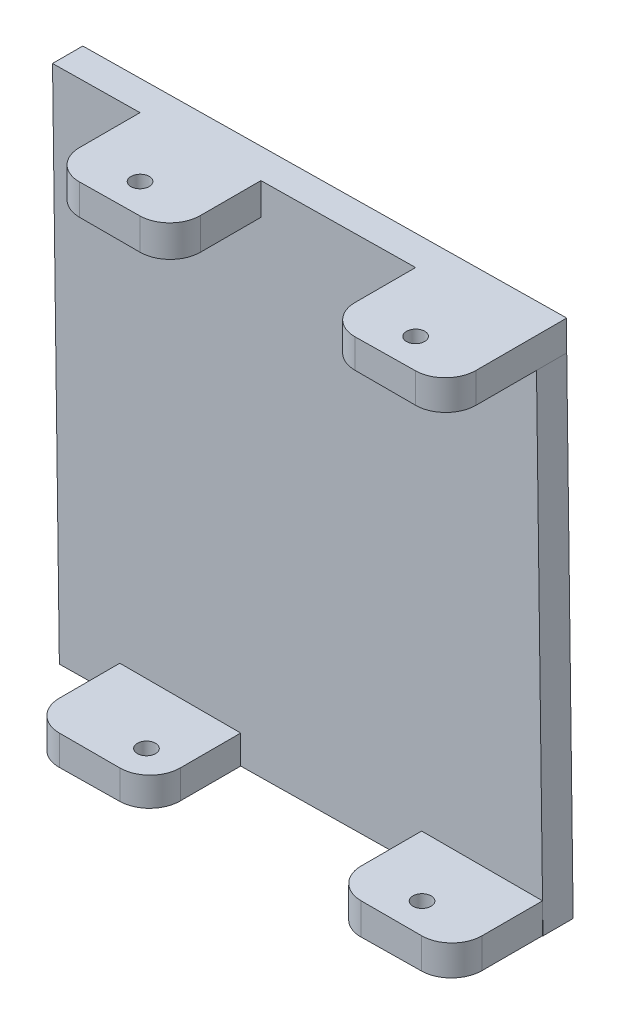
ISO-10303-21;
HEADER;
FILE_DESCRIPTION(('STEP AP214'),'2;1');
FILE_NAME('part.step','',(''),(''),'','','');
FILE_SCHEMA(('AUTOMOTIVE_DESIGN { 1 0 10303 214 1 1 1 1 }'));
ENDSEC;
DATA;
#1=APPLICATION_CONTEXT('core data for automotive mechanical design processes');
#2=APPLICATION_PROTOCOL_DEFINITION('international standard','automotive_design',2000,#1);
#3=PRODUCT_CONTEXT('',#1,'mechanical');
#4=PRODUCT('Part','Part','',(#3));
#5=PRODUCT_RELATED_PRODUCT_CATEGORY('part','',(#4));
#6=PRODUCT_DEFINITION_FORMATION('','',#4);
#7=PRODUCT_DEFINITION_CONTEXT('part definition',#1,'design');
#8=PRODUCT_DEFINITION('design','',#6,#7);
#9=PRODUCT_DEFINITION_SHAPE('','',#8);
#10=(LENGTH_UNIT() NAMED_UNIT(*) SI_UNIT(.MILLI.,.METRE.));
#11=(NAMED_UNIT(*) PLANE_ANGLE_UNIT() SI_UNIT($,.RADIAN.));
#12=(NAMED_UNIT(*) SI_UNIT($,.STERADIAN.) SOLID_ANGLE_UNIT());
#13=UNCERTAINTY_MEASURE_WITH_UNIT(LENGTH_MEASURE(1.E-05),#10,'distance_accuracy_value','');
#14=(GEOMETRIC_REPRESENTATION_CONTEXT(3) GLOBAL_UNCERTAINTY_ASSIGNED_CONTEXT((#13)) GLOBAL_UNIT_ASSIGNED_CONTEXT((#10,
#11,#12)) REPRESENTATION_CONTEXT('',''));
#15=CARTESIAN_POINT('',(0.,0.,0.));
#16=DIRECTION('',(0.,0.,1.));
#17=DIRECTION('',(1.,0.,0.));
#18=AXIS2_PLACEMENT_3D('',#15,#16,#17);
#19=CARTESIAN_POINT('',(31.8428134555891,86.5575715865727,5.));
#20=DIRECTION('',(0.0132184898575201,-0.999912631946355,0.));
#21=DIRECTION('',(0.999912631946355,0.0132184898575201,0.));
#22=AXIS2_PLACEMENT_3D('',#19,#20,#21);
#23=PLANE('',#22);
#24=CARTESIAN_POINT('',(21.9080264499716,86.4262372308753,15.));
#25=DIRECTION('',(-0.0132184898575201,0.999912631946355,0.));
#26=DIRECTION('',(-0.999912631946355,-0.0132184898575201,0.));
#27=AXIS2_PLACEMENT_3D('',#24,#25,#26);
#28=CIRCLE('',#27,1.49999999999999);
#29=CARTESIAN_POINT('',(20.4081575020521,86.406409496089,15.));
#30=VERTEX_POINT('',#29);
#31=EDGE_CURVE('E410',#30,#30,#28,.T.);
#32=ORIENTED_EDGE('',*,*,#31,.F.);
#33=EDGE_LOOP('',(#32));
#34=FACE_BOUND('',#33,.T.);
#35=DIRECTION('',(-0.999912631946355,-0.0132184898575201,0.));
#36=VECTOR('',#35,1.);
#37=CARTESIAN_POINT('',(31.9089001305081,86.5584452289433,20.));
#38=LINE('',#37,#36);
#39=CARTESIAN_POINT('',(26.9089001305081,86.4923470047825,20.));
#40=VERTEX_POINT('',#39);
#41=CARTESIAN_POINT('',(16.908900130508,86.3601505564609,20.));
#42=VERTEX_POINT('',#41);
#43=EDGE_CURVE('E500',#40,#42,#38,.T.);
#44=ORIENTED_EDGE('',*,*,#43,.F.);
#45=CARTESIAN_POINT('',(26.9089001305081,86.4923470047825,15.));
#46=DIRECTION('',(0.0132184898575201,-0.999912631946355,0.));
#47=DIRECTION('',(0.999912631946355,0.0132184898575201,0.));
#48=AXIS2_PLACEMENT_3D('',#45,#46,#47);
#49=ELLIPSE('',#48,5.00043687843744,5.);
#50=CARTESIAN_POINT('',(31.9089001305081,86.5584452289433,15.));
#51=VERTEX_POINT('',#50);
#52=EDGE_CURVE('E378',#40,#51,#49,.F.);
#53=ORIENTED_EDGE('',*,*,#52,.T.);
#54=DIRECTION('',(0.,0.,-1.));
#55=VECTOR('',#54,1.);
#56=CARTESIAN_POINT('',(31.9089001305081,86.5584452289433,20.));
#57=LINE('',#56,#55);
#58=CARTESIAN_POINT('',(31.9089001305081,86.5584452289433,0.));
#59=VERTEX_POINT('',#58);
#60=EDGE_CURVE('E481',#51,#59,#57,.T.);
#61=ORIENTED_EDGE('',*,*,#60,.T.);
#62=DIRECTION('',(-0.999912631946355,-0.0132184898575201,0.));
#63=VECTOR('',#62,1.);
#64=CARTESIAN_POINT('',(31.8428134555891,86.5575715865727,0.));
#65=LINE('',#64,#63);
#66=CARTESIAN_POINT('',(-48.1571865444109,85.5,0.));
#67=VERTEX_POINT('',#66);
#68=EDGE_CURVE('E296',#59,#67,#65,.T.);
#69=ORIENTED_EDGE('',*,*,#68,.T.);
#70=DIRECTION('',(0.,0.,-1.));
#71=VECTOR('',#70,1.);
#72=CARTESIAN_POINT('',(-48.1571865444109,85.5,5.));
#73=LINE('',#72,#71);
#74=CARTESIAN_POINT('',(-48.1571865444109,85.5,5.));
#75=VERTEX_POINT('',#74);
#76=EDGE_CURVE('E284',#75,#67,#73,.T.);
#77=ORIENTED_EDGE('',*,*,#76,.F.);
#78=DIRECTION('',(-0.999912631946355,-0.0132184898575201,0.));
#79=VECTOR('',#78,1.);
#80=CARTESIAN_POINT('',(31.8428134555891,86.5575715865727,5.));
#81=LINE('',#80,#79);
#82=CARTESIAN_POINT('',(-33.6818342792521,85.6913590157658,5.));
#83=VERTEX_POINT('',#82);
#84=EDGE_CURVE('E279',#83,#75,#81,.T.);
#85=ORIENTED_EDGE('',*,*,#84,.F.);
#86=DIRECTION('',(0.,0.,-1.));
#87=VECTOR('',#86,1.);
#88=CARTESIAN_POINT('',(-33.6818342792521,85.6913590157658,20.));
#89=LINE('',#88,#87);
#90=CARTESIAN_POINT('',(-33.6818342792521,85.6913590157658,15.));
#91=VERTEX_POINT('',#90);
#92=EDGE_CURVE('E531',#91,#83,#89,.T.);
#93=ORIENTED_EDGE('',*,*,#92,.F.);
#94=CARTESIAN_POINT('',(-28.6818342792521,85.7574572399266,15.));
#95=DIRECTION('',(0.0132184898575201,-0.999912631946355,0.));
#96=DIRECTION('',(0.999912631946355,0.0132184898575201,0.));
#97=AXIS2_PLACEMENT_3D('',#94,#95,#96);
#98=ELLIPSE('',#97,5.00043687843744,5.);
#99=CARTESIAN_POINT('',(-28.6818342792521,85.7574572399266,20.));
#100=VERTEX_POINT('',#99);
#101=EDGE_CURVE('E369',#91,#100,#98,.F.);
#102=ORIENTED_EDGE('',*,*,#101,.T.);
#103=DIRECTION('',(-0.999912631946355,-0.0132184898575201,0.));
#104=VECTOR('',#103,1.);
#105=CARTESIAN_POINT('',(-13.6818342792521,85.955751912409,20.));
#106=LINE('',#105,#104);
#107=CARTESIAN_POINT('',(-18.6818342792521,85.8896536882482,20.));
#108=VERTEX_POINT('',#107);
#109=EDGE_CURVE('E514',#108,#100,#106,.T.);
#110=ORIENTED_EDGE('',*,*,#109,.F.);
#111=CARTESIAN_POINT('',(-18.6818342792521,85.8896536882482,15.));
#112=DIRECTION('',(0.0132184898575201,-0.999912631946355,0.));
#113=DIRECTION('',(-0.999912631946355,-0.0132184898575201,0.));
#114=AXIS2_PLACEMENT_3D('',#111,#112,#113);
#115=ELLIPSE('',#114,5.00043687843744,5.);
#116=CARTESIAN_POINT('',(-13.6818342792521,85.955751912409,15.));
#117=VERTEX_POINT('',#116);
#118=EDGE_CURVE('E372',#108,#117,#115,.F.);
#119=ORIENTED_EDGE('',*,*,#118,.T.);
#120=DIRECTION('',(0.,0.,-1.));
#121=VECTOR('',#120,1.);
#122=CARTESIAN_POINT('',(-13.6818342792521,85.955751912409,20.));
#123=LINE('',#122,#121);
#124=CARTESIAN_POINT('',(-13.6818342792521,85.955751912409,5.));
#125=VERTEX_POINT('',#124);
#126=EDGE_CURVE('E522',#117,#125,#123,.T.);
#127=ORIENTED_EDGE('',*,*,#126,.T.);
#128=CARTESIAN_POINT('',(11.908900130508,86.2940523323001,5.));
#129=VERTEX_POINT('',#128);
#130=EDGE_CURVE('E280',#129,#125,#81,.T.);
#131=ORIENTED_EDGE('',*,*,#130,.F.);
#132=DIRECTION('',(0.,0.,-1.));
#133=VECTOR('',#132,1.);
#134=CARTESIAN_POINT('',(11.908900130508,86.2940523323001,20.));
#135=LINE('',#134,#133);
#136=CARTESIAN_POINT('',(11.908900130508,86.2940523323001,15.));
#137=VERTEX_POINT('',#136);
#138=EDGE_CURVE('E484',#137,#129,#135,.T.);
#139=ORIENTED_EDGE('',*,*,#138,.F.);
#140=CARTESIAN_POINT('',(16.9089001305081,86.3601505564609,15.));
#141=DIRECTION('',(0.0132184898575201,-0.999912631946355,0.));
#142=DIRECTION('',(-0.999912631946355,-0.0132184898575201,0.));
#143=AXIS2_PLACEMENT_3D('',#140,#141,#142);
#144=ELLIPSE('',#143,5.00043687843744,5.);
#145=EDGE_CURVE('E375',#137,#42,#144,.F.);
#146=ORIENTED_EDGE('',*,*,#145,.T.);
#147=EDGE_LOOP('',(#44,#53,#61,#69,#77,#85,#93,#102,#110,#119,#127,#131,#139,#146));
#148=FACE_BOUND('',#147,.T.);
#149=CARTESIAN_POINT('',(-23.6827079597886,85.823543914341,15.));
#150=DIRECTION('',(-0.0132184898575201,0.999912631946355,0.));
#151=DIRECTION('',(-0.999912631946355,-0.0132184898575201,0.));
#152=AXIS2_PLACEMENT_3D('',#149,#150,#151);
#153=CIRCLE('',#152,1.49999999999999);
#154=CARTESIAN_POINT('',(-25.1825769077081,85.8037161795547,15.));
#155=VERTEX_POINT('',#154);
#156=EDGE_CURVE('E1025',#155,#155,#153,.T.);
#157=ORIENTED_EDGE('',*,*,#156,.F.);
#158=EDGE_LOOP('',(#157));
#159=FACE_BOUND('',#158,.T.);
#160=ADVANCED_FACE('F47',(#34,#148,#159),#23,.F.);
#161=CARTESIAN_POINT('',(0.,0.,5.));
#162=DIRECTION('',(0.,0.,1.));
#163=DIRECTION('',(1.,0.,0.));
#164=AXIS2_PLACEMENT_3D('',#161,#162,#163);
#165=PLANE('',#164);
#166=DIRECTION('',(-0.01321848985752,0.999912631946355,0.));
#167=VECTOR('',#166,1.);
#168=CARTESIAN_POINT('',(32.9730930887387,1.05757158657272,5.));
#169=LINE('',#168,#167);
#170=CARTESIAN_POINT('',(32.9730930887387,1.05757158657272,5.));
#171=VERTEX_POINT('',#170);
#172=CARTESIAN_POINT('',(32.9070064138197,6.05669794420215,5.));
#173=VERTEX_POINT('',#172);
#174=EDGE_CURVE('E275',#171,#173,#169,.T.);
#175=ORIENTED_EDGE('',*,*,#174,.T.);
#176=DIRECTION('',(0.,-1.,0.));
#177=VECTOR('',#176,1.);
#178=CARTESIAN_POINT('',(32.9070064138198,0.,5.));
#179=LINE('',#178,#177);
#180=CARTESIAN_POINT('',(32.9070064138198,1.05669794420215,5.));
#181=VERTEX_POINT('',#180);
#182=EDGE_CURVE('E448',#173,#181,#179,.T.);
#183=ORIENTED_EDGE('',*,*,#182,.T.);
#184=DIRECTION('',(0.999912631946355,0.0132184898575201,0.));
#185=VECTOR('',#184,1.);
#186=CARTESIAN_POINT('',(-47.0269069112613,0.,5.));
#187=LINE('',#186,#185);
#188=EDGE_CURVE('E265',#181,#171,#187,.T.);
#189=ORIENTED_EDGE('',*,*,#188,.T.);
#190=EDGE_LOOP('',(#175,#183,#189));
#191=FACE_BOUND('',#190,.T.);
#192=ADVANCED_FACE('F636',(#191),#165,.T.);
#193=DIRECTION('',(0.,1.,0.));
#194=VECTOR('',#193,1.);
#195=CARTESIAN_POINT('',(12.9070064138198,0.,5.));
#196=LINE('',#195,#194);
#197=CARTESIAN_POINT('',(12.9070064138198,0.792305047558975,5.));
#198=VERTEX_POINT('',#197);
#199=CARTESIAN_POINT('',(12.9070064138198,6.05669794420215,5.));
#200=VERTEX_POINT('',#199);
#201=EDGE_CURVE('E248',#198,#200,#196,.T.);
#202=ORIENTED_EDGE('',*,*,#201,.T.);
#203=DIRECTION('',(1.,0.,0.));
#204=VECTOR('',#203,1.);
#205=CARTESIAN_POINT('',(0.,6.05669794420215,5.));
#206=LINE('',#205,#204);
#207=EDGE_CURVE('E255',#200,#173,#206,.T.);
#208=ORIENTED_EDGE('',*,*,#207,.T.);
#209=CARTESIAN_POINT('',(31.9089001305081,81.5584452289433,5.));
#210=VERTEX_POINT('',#209);
#211=EDGE_CURVE('E270',#173,#210,#169,.T.);
#212=ORIENTED_EDGE('',*,*,#211,.T.);
#213=DIRECTION('',(-1.,0.,0.));
#214=VECTOR('',#213,1.);
#215=CARTESIAN_POINT('',(0.,81.5584452289433,5.));
#216=LINE('',#215,#214);
#217=CARTESIAN_POINT('',(11.9089001305081,81.5584452289433,5.));
#218=VERTEX_POINT('',#217);
#219=EDGE_CURVE('E499',#210,#218,#216,.T.);
#220=ORIENTED_EDGE('',*,*,#219,.T.);
#221=DIRECTION('',(0.,1.,0.));
#222=VECTOR('',#221,1.);
#223=CARTESIAN_POINT('',(11.9089001305081,0.,5.));
#224=LINE('',#223,#222);
#225=EDGE_CURVE('E510',#218,#129,#224,.T.);
#226=ORIENTED_EDGE('',*,*,#225,.T.);
#227=ORIENTED_EDGE('',*,*,#130,.T.);
#228=DIRECTION('',(0.,-1.,0.));
#229=VECTOR('',#228,1.);
#230=CARTESIAN_POINT('',(-13.6818342792521,0.,5.));
#231=LINE('',#230,#229);
#232=CARTESIAN_POINT('',(-13.6818342792521,80.6913590157658,5.));
#233=VERTEX_POINT('',#232);
#234=EDGE_CURVE('E534',#125,#233,#231,.T.);
#235=ORIENTED_EDGE('',*,*,#234,.T.);
#236=DIRECTION('',(-1.,0.,0.));
#237=VECTOR('',#236,1.);
#238=CARTESIAN_POINT('',(0.,80.6913590157658,5.));
#239=LINE('',#238,#237);
#240=CARTESIAN_POINT('',(-33.6818342792521,80.6913590157658,5.));
#241=VERTEX_POINT('',#240);
#242=EDGE_CURVE('E538',#233,#241,#239,.T.);
#243=ORIENTED_EDGE('',*,*,#242,.T.);
#244=DIRECTION('',(0.,1.,0.));
#245=VECTOR('',#244,1.);
#246=CARTESIAN_POINT('',(-33.681834279252,0.,5.));
#247=LINE('',#246,#245);
#248=EDGE_CURVE('E290',#241,#83,#247,.T.);
#249=ORIENTED_EDGE('',*,*,#248,.T.);
#250=ORIENTED_EDGE('',*,*,#84,.T.);
#251=DIRECTION('',(0.01321848985752,-0.999912631946355,0.));
#252=VECTOR('',#251,1.);
#253=CARTESIAN_POINT('',(-48.1571865444109,85.5,5.));
#254=LINE('',#253,#252);
#255=CARTESIAN_POINT('',(-47.0269069112613,0.,5.));
#256=VERTEX_POINT('',#255);
#257=EDGE_CURVE('E271',#75,#256,#254,.T.);
#258=ORIENTED_EDGE('',*,*,#257,.T.);
#259=CARTESIAN_POINT('',(-37.0277805917978,0.132184898575208,5.));
#260=VERTEX_POINT('',#259);
#261=EDGE_CURVE('E264',#256,#260,#187,.T.);
#262=ORIENTED_EDGE('',*,*,#261,.T.);
#263=DIRECTION('',(0.,1.,0.));
#264=VECTOR('',#263,1.);
#265=CARTESIAN_POINT('',(-37.0277805917978,0.,5.));
#266=LINE('',#265,#264);
#267=CARTESIAN_POINT('',(-37.0277805917978,5.13218489857521,5.));
#268=VERTEX_POINT('',#267);
#269=EDGE_CURVE('E472',#260,#268,#266,.T.);
#270=ORIENTED_EDGE('',*,*,#269,.T.);
#271=DIRECTION('',(1.,0.,0.));
#272=VECTOR('',#271,1.);
#273=CARTESIAN_POINT('',(0.,5.13218489857521,5.));
#274=LINE('',#273,#272);
#275=CARTESIAN_POINT('',(-17.0277805917978,5.13218489857521,5.));
#276=VERTEX_POINT('',#275);
#277=EDGE_CURVE('E476',#268,#276,#274,.T.);
#278=ORIENTED_EDGE('',*,*,#277,.T.);
#279=DIRECTION('',(0.,-1.,0.));
#280=VECTOR('',#279,1.);
#281=CARTESIAN_POINT('',(-17.0277805917978,0.,5.));
#282=LINE('',#281,#280);
#283=CARTESIAN_POINT('',(-17.0277805917978,0.396577795218382,5.));
#284=VERTEX_POINT('',#283);
#285=EDGE_CURVE('E262',#276,#284,#282,.T.);
#286=ORIENTED_EDGE('',*,*,#285,.T.);
#287=EDGE_CURVE('E238',#284,#198,#187,.T.);
#288=ORIENTED_EDGE('',*,*,#287,.T.);
#289=EDGE_LOOP('',(#202,#208,#212,#220,#226,#227,#235,#243,#249,#250,#258,#262,#270,#278,#286,#288));
#290=FACE_BOUND('',#289,.T.);
#291=ADVANCED_FACE('F259',(#290),#165,.T.);
#292=CARTESIAN_POINT('',(32.9730930887387,1.05757158657272,5.));
#293=DIRECTION('',(-0.999912631946355,-0.01321848985752,0.));
#294=DIRECTION('',(0.01321848985752,-0.999912631946355,0.));
#295=AXIS2_PLACEMENT_3D('',#292,#293,#294);
#296=PLANE('',#295);
#297=DIRECTION('',(-0.01321848985752,0.999912631946355,0.));
#298=VECTOR('',#297,1.);
#299=CARTESIAN_POINT('',(32.9730930887387,1.05757158657272,0.));
#300=LINE('',#299,#298);
#301=CARTESIAN_POINT('',(32.9730930887387,1.05757158657272,0.));
#302=VERTEX_POINT('',#301);
#303=CARTESIAN_POINT('',(31.9089001305081,81.5584452289433,0.));
#304=VERTEX_POINT('',#303);
#305=EDGE_CURVE('E293',#302,#304,#300,.T.);
#306=ORIENTED_EDGE('',*,*,#305,.T.);
#307=DIRECTION('',(0.,0.,-1.));
#308=VECTOR('',#307,1.);
#309=CARTESIAN_POINT('',(31.9089001305081,81.5584452289433,20.));
#310=LINE('',#309,#308);
#311=EDGE_CURVE('E490',#210,#304,#310,.T.);
#312=ORIENTED_EDGE('',*,*,#311,.F.);
#313=ORIENTED_EDGE('',*,*,#211,.F.);
#314=ORIENTED_EDGE('',*,*,#174,.F.);
#315=DIRECTION('',(0.,0.,-1.));
#316=VECTOR('',#315,1.);
#317=CARTESIAN_POINT('',(32.9730930887387,1.05757158657272,5.));
#318=LINE('',#317,#316);
#319=EDGE_CURVE('E302',#171,#302,#318,.T.);
#320=ORIENTED_EDGE('',*,*,#319,.T.);
#321=EDGE_LOOP('',(#306,#312,#313,#314,#320));
#322=FACE_BOUND('',#321,.T.);
#323=ADVANCED_FACE('F565',(#322),#296,.F.);
#324=CARTESIAN_POINT('',(-48.1571865444109,85.5,5.));
#325=DIRECTION('',(0.999912631946355,0.01321848985752,0.));
#326=DIRECTION('',(-0.01321848985752,0.999912631946355,0.));
#327=AXIS2_PLACEMENT_3D('',#324,#325,#326);
#328=PLANE('',#327);
#329=DIRECTION('',(0.01321848985752,-0.999912631946355,0.));
#330=VECTOR('',#329,1.);
#331=CARTESIAN_POINT('',(-48.1571865444109,85.5,0.));
#332=LINE('',#331,#330);
#333=CARTESIAN_POINT('',(-47.0269069112613,0.,0.));
#334=VERTEX_POINT('',#333);
#335=EDGE_CURVE('E285',#67,#334,#332,.T.);
#336=ORIENTED_EDGE('',*,*,#335,.T.);
#337=DIRECTION('',(0.,0.,-1.));
#338=VECTOR('',#337,1.);
#339=CARTESIAN_POINT('',(-47.0269069112613,0.,5.));
#340=LINE('',#339,#338);
#341=EDGE_CURVE('E306',#256,#334,#340,.T.);
#342=ORIENTED_EDGE('',*,*,#341,.F.);
#343=ORIENTED_EDGE('',*,*,#257,.F.);
#344=ORIENTED_EDGE('',*,*,#76,.T.);
#345=EDGE_LOOP('',(#336,#342,#343,#344));
#346=FACE_BOUND('',#345,.T.);
#347=ADVANCED_FACE('F598',(#346),#328,.F.);
#348=CARTESIAN_POINT('',(-47.0269069112613,0.,5.));
#349=DIRECTION('',(-0.0132184898575201,0.999912631946355,0.));
#350=DIRECTION('',(-0.999912631946355,-0.0132184898575201,0.));
#351=AXIS2_PLACEMENT_3D('',#348,#349,#350);
#352=PLANE('',#351);
#353=CARTESIAN_POINT('',(-22.552428326639,0.323543914341001,15.));
#354=DIRECTION('',(-0.0132184898575201,0.999912631946355,0.));
#355=DIRECTION('',(-0.999912631946355,-0.0132184898575201,0.));
#356=AXIS2_PLACEMENT_3D('',#353,#354,#355);
#357=CIRCLE('',#356,1.49999999999998);
#358=CARTESIAN_POINT('',(-24.0522972745585,0.303716179554721,15.));
#359=VERTEX_POINT('',#358);
#360=EDGE_CURVE('E419',#359,#359,#357,.T.);
#361=ORIENTED_EDGE('',*,*,#360,.T.);
#362=EDGE_LOOP('',(#361));
#363=FACE_BOUND('',#362,.T.);
#364=CARTESIAN_POINT('',(23.0383060831212,0.926237230875315,15.));
#365=DIRECTION('',(-0.0132184898575201,0.999912631946355,0.));
#366=DIRECTION('',(-0.999912631946355,-0.0132184898575201,0.));
#367=AXIS2_PLACEMENT_3D('',#364,#365,#366);
#368=CIRCLE('',#367,1.49999999999998);
#369=CARTESIAN_POINT('',(21.5384371352017,0.906409496089035,15.));
#370=VERTEX_POINT('',#369);
#371=EDGE_CURVE('E416',#370,#370,#368,.T.);
#372=ORIENTED_EDGE('',*,*,#371,.T.);
#373=EDGE_LOOP('',(#372));
#374=FACE_BOUND('',#373,.T.);
#375=DIRECTION('',(0.,0.,-1.));
#376=VECTOR('',#375,1.);
#377=CARTESIAN_POINT('',(32.9070064138198,1.05669794420215,20.));
#378=LINE('',#377,#376);
#379=CARTESIAN_POINT('',(32.9070064138198,1.05669794420215,15.));
#380=VERTEX_POINT('',#379);
#381=EDGE_CURVE('E432',#380,#181,#378,.T.);
#382=ORIENTED_EDGE('',*,*,#381,.F.);
#383=CARTESIAN_POINT('',(27.9070064138198,0.990599720041359,15.));
#384=DIRECTION('',(-0.0132184898575201,0.999912631946355,0.));
#385=DIRECTION('',(0.999912631946355,0.0132184898575201,0.));
#386=AXIS2_PLACEMENT_3D('',#383,#384,#385);
#387=ELLIPSE('',#386,5.00043687843744,5.);
#388=CARTESIAN_POINT('',(27.9070064138198,0.990599720041359,20.));
#389=VERTEX_POINT('',#388);
#390=EDGE_CURVE('E335',#380,#389,#387,.F.);
#391=ORIENTED_EDGE('',*,*,#390,.T.);
#392=DIRECTION('',(0.999912631946355,0.0132184898575201,0.));
#393=VECTOR('',#392,1.);
#394=CARTESIAN_POINT('',(32.9070064138198,1.05669794420215,20.));
#395=LINE('',#394,#393);
#396=CARTESIAN_POINT('',(17.9070064138197,0.858403271719769,20.));
#397=VERTEX_POINT('',#396);
#398=EDGE_CURVE('E256',#397,#389,#395,.T.);
#399=ORIENTED_EDGE('',*,*,#398,.F.);
#400=CARTESIAN_POINT('',(17.9070064138198,0.858403271719768,15.));
#401=DIRECTION('',(-0.0132184898575201,0.999912631946355,0.));
#402=DIRECTION('',(-0.999912631946355,-0.0132184898575201,0.));
#403=AXIS2_PLACEMENT_3D('',#400,#401,#402);
#404=ELLIPSE('',#403,5.00043687843744,5.);
#405=CARTESIAN_POINT('',(12.9070064138198,0.792305047558975,15.));
#406=VERTEX_POINT('',#405);
#407=EDGE_CURVE('E240',#397,#406,#404,.F.);
#408=ORIENTED_EDGE('',*,*,#407,.T.);
#409=DIRECTION('',(0.,0.,-1.));
#410=VECTOR('',#409,1.);
#411=CARTESIAN_POINT('',(12.9070064138198,0.792305047558975,20.));
#412=LINE('',#411,#410);
#413=EDGE_CURVE('E232',#406,#198,#412,.T.);
#414=ORIENTED_EDGE('',*,*,#413,.T.);
#415=ORIENTED_EDGE('',*,*,#287,.F.);
#416=DIRECTION('',(0.,0.,-1.));
#417=VECTOR('',#416,1.);
#418=CARTESIAN_POINT('',(-17.0277805917978,0.396577795218382,20.));
#419=LINE('',#418,#417);
#420=CARTESIAN_POINT('',(-17.0277805917978,0.396577795218382,15.));
#421=VERTEX_POINT('',#420);
#422=EDGE_CURVE('E452',#421,#284,#419,.T.);
#423=ORIENTED_EDGE('',*,*,#422,.F.);
#424=CARTESIAN_POINT('',(-22.0277805917978,0.330479571057587,15.));
#425=DIRECTION('',(-0.0132184898575201,0.999912631946355,0.));
#426=DIRECTION('',(0.999912631946355,0.0132184898575201,0.));
#427=AXIS2_PLACEMENT_3D('',#424,#425,#426);
#428=ELLIPSE('',#427,5.00043687843744,5.);
#429=CARTESIAN_POINT('',(-22.0277805917978,0.330479571057588,20.));
#430=VERTEX_POINT('',#429);
#431=EDGE_CURVE('E330',#421,#430,#428,.F.);
#432=ORIENTED_EDGE('',*,*,#431,.T.);
#433=DIRECTION('',(0.999912631946355,0.0132184898575198,0.));
#434=VECTOR('',#433,1.);
#435=CARTESIAN_POINT('',(-17.0277805917978,0.396577795218382,20.));
#436=LINE('',#435,#434);
#437=CARTESIAN_POINT('',(-32.0277805917978,0.198283122736001,20.));
#438=VERTEX_POINT('',#437);
#439=EDGE_CURVE('E468',#438,#430,#436,.T.);
#440=ORIENTED_EDGE('',*,*,#439,.F.);
#441=CARTESIAN_POINT('',(-32.0277805917978,0.198283122735996,15.));
#442=DIRECTION('',(-0.0132184898575201,0.999912631946355,0.));
#443=DIRECTION('',(-0.999912631946355,-0.0132184898575201,0.));
#444=AXIS2_PLACEMENT_3D('',#441,#442,#443);
#445=ELLIPSE('',#444,5.00043687843744,5.);
#446=CARTESIAN_POINT('',(-37.0277805917978,0.132184898575208,15.));
#447=VERTEX_POINT('',#446);
#448=EDGE_CURVE('E327',#438,#447,#445,.F.);
#449=ORIENTED_EDGE('',*,*,#448,.T.);
#450=DIRECTION('',(0.,0.,-1.));
#451=VECTOR('',#450,1.);
#452=CARTESIAN_POINT('',(-37.0277805917978,0.132184898575208,20.));
#453=LINE('',#452,#451);
#454=EDGE_CURVE('E461',#447,#260,#453,.T.);
#455=ORIENTED_EDGE('',*,*,#454,.T.);
#456=ORIENTED_EDGE('',*,*,#261,.F.);
#457=ORIENTED_EDGE('',*,*,#341,.T.);
#458=DIRECTION('',(0.999912631946355,0.0132184898575201,0.));
#459=VECTOR('',#458,1.);
#460=CARTESIAN_POINT('',(-47.0269069112613,0.,0.));
#461=LINE('',#460,#459);
#462=EDGE_CURVE('E289',#334,#302,#461,.T.);
#463=ORIENTED_EDGE('',*,*,#462,.T.);
#464=ORIENTED_EDGE('',*,*,#319,.F.);
#465=ORIENTED_EDGE('',*,*,#188,.F.);
#466=EDGE_LOOP('',(#382,#391,#399,#408,#414,#415,#423,#432,#440,#449,#455,#456,#457,#463,#464,#465));
#467=FACE_BOUND('',#466,.T.);
#468=ADVANCED_FACE('F235',(#363,#374,#467),#352,.F.);
#469=CARTESIAN_POINT('',(0.,0.,0.));
#470=DIRECTION('',(0.,0.,1.));
#471=DIRECTION('',(1.,0.,0.));
#472=AXIS2_PLACEMENT_3D('',#469,#470,#471);
#473=PLANE('',#472);
#474=DIRECTION('',(0.,1.,0.));
#475=VECTOR('',#474,1.);
#476=CARTESIAN_POINT('',(31.9089001305081,81.5584452289433,0.));
#477=LINE('',#476,#475);
#478=EDGE_CURVE('E495',#304,#59,#477,.T.);
#479=ORIENTED_EDGE('',*,*,#478,.F.);
#480=ORIENTED_EDGE('',*,*,#305,.F.);
#481=ORIENTED_EDGE('',*,*,#462,.F.);
#482=ORIENTED_EDGE('',*,*,#335,.F.);
#483=ORIENTED_EDGE('',*,*,#68,.F.);
#484=EDGE_LOOP('',(#479,#480,#481,#482,#483));
#485=FACE_BOUND('',#484,.T.);
#486=ADVANCED_FACE('F595',(#485),#473,.F.);
#487=CARTESIAN_POINT('',(-33.6818342792521,85.6913590157658,20.));
#488=DIRECTION('',(1.,0.,0.));
#489=DIRECTION('',(0.,1.,0.));
#490=AXIS2_PLACEMENT_3D('',#487,#488,#489);
#491=PLANE('',#490);
#492=DIRECTION('',(0.,0.,-1.));
#493=VECTOR('',#492,1.);
#494=CARTESIAN_POINT('',(-33.6818342792521,80.6913590157658,20.));
#495=LINE('',#494,#493);
#496=CARTESIAN_POINT('',(-33.6818342792521,80.6913590157658,15.));
#497=VERTEX_POINT('',#496);
#498=EDGE_CURVE('E528',#497,#241,#495,.T.);
#499=ORIENTED_EDGE('',*,*,#498,.F.);
#500=DIRECTION('',(0.,-1.,0.));
#501=VECTOR('',#500,1.);
#502=CARTESIAN_POINT('',(-33.6818342792521,85.6913590157658,15.));
#503=LINE('',#502,#501);
#504=EDGE_CURVE('E12',#497,#91,#503,.F.);
#505=ORIENTED_EDGE('',*,*,#504,.T.);
#506=ORIENTED_EDGE('',*,*,#92,.T.);
#507=ORIENTED_EDGE('',*,*,#248,.F.);
#508=EDGE_LOOP('',(#499,#505,#506,#507));
#509=FACE_BOUND('',#508,.T.);
#510=ADVANCED_FACE('F719',(#509),#491,.F.);
#511=CARTESIAN_POINT('',(-33.6818342792521,80.6913590157658,20.));
#512=DIRECTION('',(0.,1.,0.));
#513=DIRECTION('',(-1.,0.,0.));
#514=AXIS2_PLACEMENT_3D('',#511,#512,#513);
#515=PLANE('',#514);
#516=CARTESIAN_POINT('',(-23.6148622982164,80.6913590157658,15.));
#517=DIRECTION('',(0.,1.,0.));
#518=DIRECTION('',(-1.,0.,0.));
#519=AXIS2_PLACEMENT_3D('',#516,#517,#518);
#520=ELLIPSE('',#519,1.50013106353122,1.49999999999998);
#521=CARTESIAN_POINT('',(-25.1149933617477,80.6913590157658,15.));
#522=VERTEX_POINT('',#521);
#523=EDGE_CURVE('E425',#522,#522,#520,.T.);
#524=ORIENTED_EDGE('',*,*,#523,.T.);
#525=EDGE_LOOP('',(#524));
#526=FACE_BOUND('',#525,.T.);
#527=DIRECTION('',(0.,0.,-1.));
#528=VECTOR('',#527,1.);
#529=CARTESIAN_POINT('',(-13.6818342792521,80.6913590157658,20.));
#530=LINE('',#529,#528);
#531=CARTESIAN_POINT('',(-13.6818342792521,80.6913590157658,15.));
#532=VERTEX_POINT('',#531);
#533=EDGE_CURVE('E525',#532,#233,#530,.T.);
#534=ORIENTED_EDGE('',*,*,#533,.F.);
#535=CARTESIAN_POINT('',(-18.6818342792521,80.6913590157658,15.));
#536=DIRECTION('',(0.,1.,0.));
#537=DIRECTION('',(-1.,0.,0.));
#538=AXIS2_PLACEMENT_3D('',#535,#536,#537);
#539=CIRCLE('',#538,5.);
#540=CARTESIAN_POINT('',(-18.6818342792521,80.6913590157658,20.));
#541=VERTEX_POINT('',#540);
#542=EDGE_CURVE('E57',#532,#541,#539,.F.);
#543=ORIENTED_EDGE('',*,*,#542,.T.);
#544=DIRECTION('',(1.,0.,0.));
#545=VECTOR('',#544,1.);
#546=CARTESIAN_POINT('',(-33.6818342792521,80.6913590157658,20.));
#547=LINE('',#546,#545);
#548=CARTESIAN_POINT('',(-28.6818342792521,80.6913590157658,20.));
#549=VERTEX_POINT('',#548);
#550=EDGE_CURVE('E518',#549,#541,#547,.T.);
#551=ORIENTED_EDGE('',*,*,#550,.F.);
#552=CARTESIAN_POINT('',(-28.6818342792521,80.6913590157658,15.));
#553=DIRECTION('',(0.,1.,0.));
#554=DIRECTION('',(-1.,0.,0.));
#555=AXIS2_PLACEMENT_3D('',#552,#553,#554);
#556=CIRCLE('',#555,5.);
#557=EDGE_CURVE('E65',#549,#497,#556,.F.);
#558=ORIENTED_EDGE('',*,*,#557,.T.);
#559=ORIENTED_EDGE('',*,*,#498,.T.);
#560=ORIENTED_EDGE('',*,*,#242,.F.);
#561=EDGE_LOOP('',(#534,#543,#551,#558,#559,#560));
#562=FACE_BOUND('',#561,.T.);
#563=ADVANCED_FACE('F716',(#526,#562),#515,.F.);
#564=CARTESIAN_POINT('',(-13.6818342792521,80.6913590157658,20.));
#565=DIRECTION('',(-1.,0.,0.));
#566=DIRECTION('',(0.,0.,1.));
#567=AXIS2_PLACEMENT_3D('',#564,#565,#566);
#568=PLANE('',#567);
#569=ORIENTED_EDGE('',*,*,#126,.F.);
#570=DIRECTION('',(0.,1.,0.));
#571=VECTOR('',#570,1.);
#572=CARTESIAN_POINT('',(-13.6818342792521,80.6913590157658,15.));
#573=LINE('',#572,#571);
#574=EDGE_CURVE('E73',#117,#532,#573,.F.);
#575=ORIENTED_EDGE('',*,*,#574,.T.);
#576=ORIENTED_EDGE('',*,*,#533,.T.);
#577=ORIENTED_EDGE('',*,*,#234,.F.);
#578=EDGE_LOOP('',(#569,#575,#576,#577));
#579=FACE_BOUND('',#578,.T.);
#580=ADVANCED_FACE('F712',(#579),#568,.F.);
#581=CARTESIAN_POINT('',(0.,0.,20.));
#582=DIRECTION('',(0.,0.,1.));
#583=DIRECTION('',(1.,0.,0.));
#584=AXIS2_PLACEMENT_3D('',#581,#582,#583);
#585=PLANE('',#584);
#586=ORIENTED_EDGE('',*,*,#550,.T.);
#587=DIRECTION('',(0.,1.,0.));
#588=VECTOR('',#587,1.);
#589=CARTESIAN_POINT('',(-18.6818342792521,85.955751912409,20.));
#590=LINE('',#589,#588);
#591=EDGE_CURVE('E397',#541,#108,#590,.T.);
#592=ORIENTED_EDGE('',*,*,#591,.T.);
#593=ORIENTED_EDGE('',*,*,#109,.T.);
#594=DIRECTION('',(0.,-1.,0.));
#595=VECTOR('',#594,1.);
#596=CARTESIAN_POINT('',(-28.6818342792521,80.6913590157658,20.));
#597=LINE('',#596,#595);
#598=EDGE_CURVE('E393',#100,#549,#597,.T.);
#599=ORIENTED_EDGE('',*,*,#598,.T.);
#600=EDGE_LOOP('',(#586,#592,#593,#599));
#601=FACE_BOUND('',#600,.T.);
#602=ADVANCED_FACE('F702',(#601),#585,.T.);
#603=CARTESIAN_POINT('',(31.9089001305081,81.5584452289433,20.));
#604=DIRECTION('',(-1.,0.,0.));
#605=DIRECTION('',(0.,-1.,0.));
#606=AXIS2_PLACEMENT_3D('',#603,#604,#605);
#607=PLANE('',#606);
#608=ORIENTED_EDGE('',*,*,#60,.F.);
#609=DIRECTION('',(0.,1.,0.));
#610=VECTOR('',#609,1.);
#611=CARTESIAN_POINT('',(31.9089001305081,81.5584452289433,15.));
#612=LINE('',#611,#610);
#613=CARTESIAN_POINT('',(31.9089001305081,81.5584452289433,15.));
#614=VERTEX_POINT('',#613);
#615=EDGE_CURVE('E381',#51,#614,#612,.F.);
#616=ORIENTED_EDGE('',*,*,#615,.T.);
#617=EDGE_CURVE('E491',#614,#210,#310,.T.);
#618=ORIENTED_EDGE('',*,*,#617,.T.);
#619=ORIENTED_EDGE('',*,*,#311,.T.);
#620=ORIENTED_EDGE('',*,*,#478,.T.);
#621=EDGE_LOOP('',(#608,#616,#618,#619,#620));
#622=FACE_BOUND('',#621,.T.);
#623=ADVANCED_FACE('F593',(#622),#607,.F.);
#624=CARTESIAN_POINT('',(11.908900130508,86.2940523323001,20.));
#625=DIRECTION('',(1.,0.,0.));
#626=DIRECTION('',(0.,1.,0.));
#627=AXIS2_PLACEMENT_3D('',#624,#625,#626);
#628=PLANE('',#627);
#629=DIRECTION('',(0.,0.,-1.));
#630=VECTOR('',#629,1.);
#631=CARTESIAN_POINT('',(11.9089001305081,81.5584452289433,20.));
#632=LINE('',#631,#630);
#633=CARTESIAN_POINT('',(11.9089001305081,81.5584452289433,15.));
#634=VERTEX_POINT('',#633);
#635=EDGE_CURVE('E487',#634,#218,#632,.T.);
#636=ORIENTED_EDGE('',*,*,#635,.F.);
#637=DIRECTION('',(0.,-1.,0.));
#638=VECTOR('',#637,1.);
#639=CARTESIAN_POINT('',(11.908900130508,86.2940523323001,15.));
#640=LINE('',#639,#638);
#641=EDGE_CURVE('E390',#634,#137,#640,.F.);
#642=ORIENTED_EDGE('',*,*,#641,.T.);
#643=ORIENTED_EDGE('',*,*,#138,.T.);
#644=ORIENTED_EDGE('',*,*,#225,.F.);
#645=EDGE_LOOP('',(#636,#642,#643,#644));
#646=FACE_BOUND('',#645,.T.);
#647=ADVANCED_FACE('F578',(#646),#628,.F.);
#648=CARTESIAN_POINT('',(11.9089001305081,81.5584452289433,20.));
#649=DIRECTION('',(0.,1.,0.));
#650=DIRECTION('',(-1.,0.,0.));
#651=AXIS2_PLACEMENT_3D('',#648,#649,#650);
#652=PLANE('',#651);
#653=CARTESIAN_POINT('',(21.972376931354,81.5584452289433,15.));
#654=DIRECTION('',(0.,1.,0.));
#655=DIRECTION('',(-1.,0.,0.));
#656=AXIS2_PLACEMENT_3D('',#653,#654,#655);
#657=ELLIPSE('',#656,1.50013106353122,1.49999999999998);
#658=CARTESIAN_POINT('',(20.4722458678227,81.5584452289433,15.));
#659=VERTEX_POINT('',#658);
#660=EDGE_CURVE('E409',#659,#659,#657,.T.);
#661=ORIENTED_EDGE('',*,*,#660,.T.);
#662=EDGE_LOOP('',(#661));
#663=FACE_BOUND('',#662,.T.);
#664=ORIENTED_EDGE('',*,*,#617,.F.);
#665=CARTESIAN_POINT('',(26.9089001305081,81.5584452289433,15.));
#666=DIRECTION('',(0.,1.,0.));
#667=DIRECTION('',(-1.,0.,0.));
#668=AXIS2_PLACEMENT_3D('',#665,#666,#667);
#669=CIRCLE('',#668,5.);
#670=CARTESIAN_POINT('',(26.9089001305081,81.5584452289433,20.));
#671=VERTEX_POINT('',#670);
#672=EDGE_CURVE('E387',#614,#671,#669,.F.);
#673=ORIENTED_EDGE('',*,*,#672,.T.);
#674=DIRECTION('',(1.,0.,0.));
#675=VECTOR('',#674,1.);
#676=CARTESIAN_POINT('',(11.9089001305081,81.5584452289433,20.));
#677=LINE('',#676,#675);
#678=CARTESIAN_POINT('',(16.9089001305081,81.5584452289433,20.));
#679=VERTEX_POINT('',#678);
#680=EDGE_CURVE('E494',#679,#671,#677,.T.);
#681=ORIENTED_EDGE('',*,*,#680,.F.);
#682=CARTESIAN_POINT('',(16.9089001305081,81.5584452289433,15.));
#683=DIRECTION('',(0.,1.,0.));
#684=DIRECTION('',(-1.,0.,0.));
#685=AXIS2_PLACEMENT_3D('',#682,#683,#684);
#686=CIRCLE('',#685,5.);
#687=EDGE_CURVE('E384',#679,#634,#686,.F.);
#688=ORIENTED_EDGE('',*,*,#687,.T.);
#689=ORIENTED_EDGE('',*,*,#635,.T.);
#690=ORIENTED_EDGE('',*,*,#219,.F.);
#691=EDGE_LOOP('',(#664,#673,#681,#688,#689,#690));
#692=FACE_BOUND('',#691,.T.);
#693=ADVANCED_FACE('F572',(#663,#692),#652,.F.);
#694=CARTESIAN_POINT('',(0.,0.,20.));
#695=DIRECTION('',(0.,0.,-1.));
#696=DIRECTION('',(-1.,0.,0.));
#697=AXIS2_PLACEMENT_3D('',#694,#695,#696);
#698=PLANE('',#697);
#699=ORIENTED_EDGE('',*,*,#680,.T.);
#700=DIRECTION('',(0.,1.,0.));
#701=VECTOR('',#700,1.);
#702=CARTESIAN_POINT('',(26.9089001305079,0.,20.));
#703=LINE('',#702,#701);
#704=EDGE_CURVE('E365',#671,#40,#703,.T.);
#705=ORIENTED_EDGE('',*,*,#704,.T.);
#706=ORIENTED_EDGE('',*,*,#43,.T.);
#707=DIRECTION('',(0.,-1.,0.));
#708=VECTOR('',#707,1.);
#709=CARTESIAN_POINT('',(16.9089001305081,0.,20.));
#710=LINE('',#709,#708);
#711=EDGE_CURVE('E361',#42,#679,#710,.T.);
#712=ORIENTED_EDGE('',*,*,#711,.T.);
#713=EDGE_LOOP('',(#699,#705,#706,#712));
#714=FACE_BOUND('',#713,.T.);
#715=ADVANCED_FACE('F586',(#714),#698,.F.);
#716=CARTESIAN_POINT('',(-17.0277805917978,5.13218489857521,20.));
#717=DIRECTION('',(-1.,0.,0.));
#718=DIRECTION('',(0.,0.,1.));
#719=AXIS2_PLACEMENT_3D('',#716,#717,#718);
#720=PLANE('',#719);
#721=DIRECTION('',(0.,0.,-1.));
#722=VECTOR('',#721,1.);
#723=CARTESIAN_POINT('',(-17.0277805917978,5.13218489857521,20.));
#724=LINE('',#723,#722);
#725=CARTESIAN_POINT('',(-17.0277805917978,5.13218489857521,15.));
#726=VERTEX_POINT('',#725);
#727=EDGE_CURVE('E455',#726,#276,#724,.T.);
#728=ORIENTED_EDGE('',*,*,#727,.F.);
#729=DIRECTION('',(0.,1.,0.));
#730=VECTOR('',#729,1.);
#731=CARTESIAN_POINT('',(-17.0277805917978,5.13218489857521,15.));
#732=LINE('',#731,#730);
#733=EDGE_CURVE('E355',#726,#421,#732,.F.);
#734=ORIENTED_EDGE('',*,*,#733,.T.);
#735=ORIENTED_EDGE('',*,*,#422,.T.);
#736=ORIENTED_EDGE('',*,*,#285,.F.);
#737=EDGE_LOOP('',(#728,#734,#735,#736));
#738=FACE_BOUND('',#737,.T.);
#739=ADVANCED_FACE('F616',(#738),#720,.F.);
#740=CARTESIAN_POINT('',(-37.0277805917978,5.13218489857521,20.));
#741=DIRECTION('',(0.,-1.,0.));
#742=DIRECTION('',(1.,0.,0.));
#743=AXIS2_PLACEMENT_3D('',#740,#741,#742);
#744=PLANE('',#743);
#745=CARTESIAN_POINT('',(-22.6159968525759,5.13218489857521,15.));
#746=DIRECTION('',(0.,-1.,0.));
#747=DIRECTION('',(-1.,0.,0.));
#748=AXIS2_PLACEMENT_3D('',#745,#746,#747);
#749=ELLIPSE('',#748,1.50013106353122,1.49999999999998);
#750=CARTESIAN_POINT('',(-24.1161279161071,5.13218489857521,15.));
#751=VERTEX_POINT('',#750);
#752=EDGE_CURVE('E51',#751,#751,#749,.T.);
#753=ORIENTED_EDGE('',*,*,#752,.T.);
#754=EDGE_LOOP('',(#753));
#755=FACE_BOUND('',#754,.T.);
#756=DIRECTION('',(-1.,0.,0.));
#757=VECTOR('',#756,1.);
#758=CARTESIAN_POINT('',(-37.0277805917978,5.13218489857521,20.));
#759=LINE('',#758,#757);
#760=CARTESIAN_POINT('',(-22.0277805917978,5.13218489857521,20.));
#761=VERTEX_POINT('',#760);
#762=CARTESIAN_POINT('',(-32.0277805917978,5.13218489857521,20.));
#763=VERTEX_POINT('',#762);
#764=EDGE_CURVE('E464',#761,#763,#759,.T.);
#765=ORIENTED_EDGE('',*,*,#764,.F.);
#766=CARTESIAN_POINT('',(-22.0277805917978,5.13218489857521,15.));
#767=DIRECTION('',(0.,-1.,0.));
#768=DIRECTION('',(1.,0.,0.));
#769=AXIS2_PLACEMENT_3D('',#766,#767,#768);
#770=CIRCLE('',#769,5.);
#771=EDGE_CURVE('E352',#761,#726,#770,.F.);
#772=ORIENTED_EDGE('',*,*,#771,.T.);
#773=ORIENTED_EDGE('',*,*,#727,.T.);
#774=ORIENTED_EDGE('',*,*,#277,.F.);
#775=DIRECTION('',(0.,0.,-1.));
#776=VECTOR('',#775,1.);
#777=CARTESIAN_POINT('',(-37.0277805917978,5.13218489857521,20.));
#778=LINE('',#777,#776);
#779=CARTESIAN_POINT('',(-37.0277805917978,5.13218489857521,15.));
#780=VERTEX_POINT('',#779);
#781=EDGE_CURVE('E458',#780,#268,#778,.T.);
#782=ORIENTED_EDGE('',*,*,#781,.F.);
#783=CARTESIAN_POINT('',(-32.0277805917978,5.13218489857521,15.));
#784=DIRECTION('',(0.,-1.,0.));
#785=DIRECTION('',(1.,0.,0.));
#786=AXIS2_PLACEMENT_3D('',#783,#784,#785);
#787=CIRCLE('',#786,5.);
#788=EDGE_CURVE('E349',#780,#763,#787,.F.);
#789=ORIENTED_EDGE('',*,*,#788,.T.);
#790=EDGE_LOOP('',(#765,#772,#773,#774,#782,#789));
#791=FACE_BOUND('',#790,.T.);
#792=ADVANCED_FACE('F612',(#755,#791),#744,.F.);
#793=CARTESIAN_POINT('',(-37.0277805917978,0.132184898575208,20.));
#794=DIRECTION('',(1.,0.,0.));
#795=DIRECTION('',(0.,1.,0.));
#796=AXIS2_PLACEMENT_3D('',#793,#794,#795);
#797=PLANE('',#796);
#798=ORIENTED_EDGE('',*,*,#454,.F.);
#799=DIRECTION('',(0.,-1.,0.));
#800=VECTOR('',#799,1.);
#801=CARTESIAN_POINT('',(-37.0277805917978,0.132184898575208,15.));
#802=LINE('',#801,#800);
#803=EDGE_CURVE('E358',#447,#780,#802,.F.);
#804=ORIENTED_EDGE('',*,*,#803,.T.);
#805=ORIENTED_EDGE('',*,*,#781,.T.);
#806=ORIENTED_EDGE('',*,*,#269,.F.);
#807=EDGE_LOOP('',(#798,#804,#805,#806));
#808=FACE_BOUND('',#807,.T.);
#809=ADVANCED_FACE('F606',(#808),#797,.F.);
#810=CARTESIAN_POINT('',(0.,0.,20.));
#811=DIRECTION('',(0.,0.,-1.));
#812=DIRECTION('',(-1.,0.,0.));
#813=AXIS2_PLACEMENT_3D('',#810,#811,#812);
#814=PLANE('',#813);
#815=ORIENTED_EDGE('',*,*,#439,.T.);
#816=DIRECTION('',(0.,1.,0.));
#817=VECTOR('',#816,1.);
#818=CARTESIAN_POINT('',(-22.0277805917978,0.,20.));
#819=LINE('',#818,#817);
#820=EDGE_CURVE('E345',#430,#761,#819,.T.);
#821=ORIENTED_EDGE('',*,*,#820,.T.);
#822=ORIENTED_EDGE('',*,*,#764,.T.);
#823=DIRECTION('',(0.,-1.,0.));
#824=VECTOR('',#823,1.);
#825=CARTESIAN_POINT('',(-32.0277805917978,0.,20.));
#826=LINE('',#825,#824);
#827=EDGE_CURVE('E341',#763,#438,#826,.T.);
#828=ORIENTED_EDGE('',*,*,#827,.T.);
#829=EDGE_LOOP('',(#815,#821,#822,#828));
#830=FACE_BOUND('',#829,.T.);
#831=ADVANCED_FACE('F622',(#830),#814,.F.);
#832=CARTESIAN_POINT('',(32.9070064138197,6.05669794420215,20.));
#833=DIRECTION('',(-1.,0.,0.));
#834=DIRECTION('',(0.,-1.,0.));
#835=AXIS2_PLACEMENT_3D('',#832,#833,#834);
#836=PLANE('',#835);
#837=DIRECTION('',(0.,0.,-1.));
#838=VECTOR('',#837,1.);
#839=CARTESIAN_POINT('',(32.9070064138197,6.05669794420215,20.));
#840=LINE('',#839,#838);
#841=CARTESIAN_POINT('',(32.9070064138197,6.05669794420215,15.));
#842=VERTEX_POINT('',#841);
#843=EDGE_CURVE('E435',#842,#173,#840,.T.);
#844=ORIENTED_EDGE('',*,*,#843,.F.);
#845=DIRECTION('',(0.,1.,0.));
#846=VECTOR('',#845,1.);
#847=CARTESIAN_POINT('',(32.9070064138197,6.05669794420215,15.));
#848=LINE('',#847,#846);
#849=EDGE_CURVE('E324',#842,#380,#848,.F.);
#850=ORIENTED_EDGE('',*,*,#849,.T.);
#851=ORIENTED_EDGE('',*,*,#381,.T.);
#852=ORIENTED_EDGE('',*,*,#182,.F.);
#853=EDGE_LOOP('',(#844,#850,#851,#852));
#854=FACE_BOUND('',#853,.T.);
#855=ADVANCED_FACE('F674',(#854),#836,.F.);
#856=CARTESIAN_POINT('',(12.9070064138198,6.05669794420215,20.));
#857=DIRECTION('',(0.,-1.,0.));
#858=DIRECTION('',(1.,0.,0.));
#859=AXIS2_PLACEMENT_3D('',#856,#857,#858);
#860=PLANE('',#859);
#861=CARTESIAN_POINT('',(22.9704832146657,6.05669794420215,15.));
#862=DIRECTION('',(0.,-1.,0.));
#863=DIRECTION('',(-1.,0.,0.));
#864=AXIS2_PLACEMENT_3D('',#861,#862,#863);
#865=ELLIPSE('',#864,1.50013106353122,1.49999999999998);
#866=CARTESIAN_POINT('',(21.4703521511344,6.05669794420215,15.));
#867=VERTEX_POINT('',#866);
#868=EDGE_CURVE('E406',#867,#867,#865,.T.);
#869=ORIENTED_EDGE('',*,*,#868,.T.);
#870=EDGE_LOOP('',(#869));
#871=FACE_BOUND('',#870,.T.);
#872=DIRECTION('',(-1.,0.,0.));
#873=VECTOR('',#872,1.);
#874=CARTESIAN_POINT('',(12.9070064138198,6.05669794420215,20.));
#875=LINE('',#874,#873);
#876=CARTESIAN_POINT('',(27.9070064138197,6.05669794420215,20.));
#877=VERTEX_POINT('',#876);
#878=CARTESIAN_POINT('',(17.9070064138198,6.05669794420215,20.));
#879=VERTEX_POINT('',#878);
#880=EDGE_CURVE('E244',#877,#879,#875,.T.);
#881=ORIENTED_EDGE('',*,*,#880,.F.);
#882=CARTESIAN_POINT('',(27.9070064138197,6.05669794420215,15.));
#883=DIRECTION('',(0.,-1.,0.));
#884=DIRECTION('',(1.,0.,0.));
#885=AXIS2_PLACEMENT_3D('',#882,#883,#884);
#886=CIRCLE('',#885,5.);
#887=EDGE_CURVE('E321',#877,#842,#886,.F.);
#888=ORIENTED_EDGE('',*,*,#887,.T.);
#889=ORIENTED_EDGE('',*,*,#843,.T.);
#890=ORIENTED_EDGE('',*,*,#207,.F.);
#891=DIRECTION('',(0.,0.,-1.));
#892=VECTOR('',#891,1.);
#893=CARTESIAN_POINT('',(12.9070064138198,6.05669794420215,20.));
#894=LINE('',#893,#892);
#895=CARTESIAN_POINT('',(12.9070064138198,6.05669794420215,15.));
#896=VERTEX_POINT('',#895);
#897=EDGE_CURVE('E245',#896,#200,#894,.T.);
#898=ORIENTED_EDGE('',*,*,#897,.F.);
#899=CARTESIAN_POINT('',(17.9070064138198,6.05669794420215,15.));
#900=DIRECTION('',(0.,-1.,0.));
#901=DIRECTION('',(1.,0.,0.));
#902=AXIS2_PLACEMENT_3D('',#899,#900,#901);
#903=CIRCLE('',#902,5.);
#904=EDGE_CURVE('E318',#896,#879,#903,.F.);
#905=ORIENTED_EDGE('',*,*,#904,.T.);
#906=EDGE_LOOP('',(#881,#888,#889,#890,#898,#905));
#907=FACE_BOUND('',#906,.T.);
#908=ADVANCED_FACE('F666',(#871,#907),#860,.F.);
#909=CARTESIAN_POINT('',(12.9070064138198,0.792305047558975,20.));
#910=DIRECTION('',(1.,0.,0.));
#911=DIRECTION('',(0.,0.,-1.));
#912=AXIS2_PLACEMENT_3D('',#909,#910,#911);
#913=PLANE('',#912);
#914=ORIENTED_EDGE('',*,*,#413,.F.);
#915=DIRECTION('',(0.,-1.,0.));
#916=VECTOR('',#915,1.);
#917=CARTESIAN_POINT('',(12.9070064138198,0.792305047558975,15.));
#918=LINE('',#917,#916);
#919=EDGE_CURVE('E338',#406,#896,#918,.F.);
#920=ORIENTED_EDGE('',*,*,#919,.T.);
#921=ORIENTED_EDGE('',*,*,#897,.T.);
#922=ORIENTED_EDGE('',*,*,#201,.F.);
#923=EDGE_LOOP('',(#914,#920,#921,#922));
#924=FACE_BOUND('',#923,.T.);
#925=ADVANCED_FACE('F249',(#924),#913,.F.);
#926=CARTESIAN_POINT('',(0.,0.,20.));
#927=DIRECTION('',(0.,0.,-1.));
#928=DIRECTION('',(-1.,0.,0.));
#929=AXIS2_PLACEMENT_3D('',#926,#927,#928);
#930=PLANE('',#929);
#931=ORIENTED_EDGE('',*,*,#398,.T.);
#932=DIRECTION('',(0.,1.,0.));
#933=VECTOR('',#932,1.);
#934=CARTESIAN_POINT('',(27.9070064138198,0.,20.));
#935=LINE('',#934,#933);
#936=EDGE_CURVE('E314',#389,#877,#935,.T.);
#937=ORIENTED_EDGE('',*,*,#936,.T.);
#938=ORIENTED_EDGE('',*,*,#880,.T.);
#939=DIRECTION('',(0.,-1.,0.));
#940=VECTOR('',#939,1.);
#941=CARTESIAN_POINT('',(17.9070064138198,0.,20.));
#942=LINE('',#941,#940);
#943=EDGE_CURVE('E310',#879,#397,#942,.T.);
#944=ORIENTED_EDGE('',*,*,#943,.T.);
#945=EDGE_LOOP('',(#931,#937,#938,#944));
#946=FACE_BOUND('',#945,.T.);
#947=ADVANCED_FACE('F656',(#946),#930,.F.);
#948=CARTESIAN_POINT('',(27.9070064138198,0.,15.));
#949=DIRECTION('',(0.,1.,0.));
#950=DIRECTION('',(-1.,0.,0.));
#951=AXIS2_PLACEMENT_3D('',#948,#949,#950);
#952=CYLINDRICAL_SURFACE('',#951,5.);
#953=ORIENTED_EDGE('',*,*,#390,.F.);
#954=ORIENTED_EDGE('',*,*,#849,.F.);
#955=ORIENTED_EDGE('',*,*,#887,.F.);
#956=ORIENTED_EDGE('',*,*,#936,.F.);
#957=EDGE_LOOP('',(#953,#954,#955,#956));
#958=FACE_BOUND('',#957,.T.);
#959=ADVANCED_FACE('F653',(#958),#952,.T.);
#960=CARTESIAN_POINT('',(17.9070064138198,0.,15.));
#961=DIRECTION('',(0.,-1.,0.));
#962=DIRECTION('',(0.,0.,-1.));
#963=AXIS2_PLACEMENT_3D('',#960,#961,#962);
#964=CYLINDRICAL_SURFACE('',#963,5.);
#965=ORIENTED_EDGE('',*,*,#904,.F.);
#966=ORIENTED_EDGE('',*,*,#919,.F.);
#967=ORIENTED_EDGE('',*,*,#407,.F.);
#968=ORIENTED_EDGE('',*,*,#943,.F.);
#969=EDGE_LOOP('',(#965,#966,#967,#968));
#970=FACE_BOUND('',#969,.T.);
#971=ADVANCED_FACE('F633',(#970),#964,.T.);
#972=CARTESIAN_POINT('',(-22.0277805917978,0.,15.));
#973=DIRECTION('',(0.,1.,0.));
#974=DIRECTION('',(0.,0.,1.));
#975=AXIS2_PLACEMENT_3D('',#972,#973,#974);
#976=CYLINDRICAL_SURFACE('',#975,5.);
#977=ORIENTED_EDGE('',*,*,#431,.F.);
#978=ORIENTED_EDGE('',*,*,#733,.F.);
#979=ORIENTED_EDGE('',*,*,#771,.F.);
#980=ORIENTED_EDGE('',*,*,#820,.F.);
#981=EDGE_LOOP('',(#977,#978,#979,#980));
#982=FACE_BOUND('',#981,.T.);
#983=ADVANCED_FACE('F620',(#982),#976,.T.);
#984=CARTESIAN_POINT('',(-32.0277805917978,0.,15.));
#985=DIRECTION('',(0.,-1.,0.));
#986=DIRECTION('',(1.,0.,0.));
#987=AXIS2_PLACEMENT_3D('',#984,#985,#986);
#988=CYLINDRICAL_SURFACE('',#987,5.);
#989=ORIENTED_EDGE('',*,*,#788,.F.);
#990=ORIENTED_EDGE('',*,*,#803,.F.);
#991=ORIENTED_EDGE('',*,*,#448,.F.);
#992=ORIENTED_EDGE('',*,*,#827,.F.);
#993=EDGE_LOOP('',(#989,#990,#991,#992));
#994=FACE_BOUND('',#993,.T.);
#995=ADVANCED_FACE('F625',(#994),#988,.T.);
#996=CARTESIAN_POINT('',(26.9089001305079,0.,15.));
#997=DIRECTION('',(0.,1.,0.));
#998=DIRECTION('',(-1.,0.,0.));
#999=AXIS2_PLACEMENT_3D('',#996,#997,#998);
#1000=CYLINDRICAL_SURFACE('',#999,5.);
#1001=ORIENTED_EDGE('',*,*,#672,.F.);
#1002=ORIENTED_EDGE('',*,*,#615,.F.);
#1003=ORIENTED_EDGE('',*,*,#52,.F.);
#1004=ORIENTED_EDGE('',*,*,#704,.F.);
#1005=EDGE_LOOP('',(#1001,#1002,#1003,#1004));
#1006=FACE_BOUND('',#1005,.T.);
#1007=ADVANCED_FACE('F589',(#1006),#1000,.T.);
#1008=CARTESIAN_POINT('',(16.9089001305081,0.,15.));
#1009=DIRECTION('',(0.,-1.,0.));
#1010=DIRECTION('',(1.,0.,0.));
#1011=AXIS2_PLACEMENT_3D('',#1008,#1009,#1010);
#1012=CYLINDRICAL_SURFACE('',#1011,5.);
#1013=ORIENTED_EDGE('',*,*,#145,.F.);
#1014=ORIENTED_EDGE('',*,*,#641,.F.);
#1015=ORIENTED_EDGE('',*,*,#687,.F.);
#1016=ORIENTED_EDGE('',*,*,#711,.F.);
#1017=EDGE_LOOP('',(#1013,#1014,#1015,#1016));
#1018=FACE_BOUND('',#1017,.T.);
#1019=ADVANCED_FACE('F582',(#1018),#1012,.T.);
#1020=CARTESIAN_POINT('',(-18.6818342792521,0.,15.));
#1021=DIRECTION('',(0.,-1.,0.));
#1022=DIRECTION('',(0.,0.,-1.));
#1023=AXIS2_PLACEMENT_3D('',#1020,#1021,#1022);
#1024=CYLINDRICAL_SURFACE('',#1023,5.);
#1025=ORIENTED_EDGE('',*,*,#542,.F.);
#1026=ORIENTED_EDGE('',*,*,#574,.F.);
#1027=ORIENTED_EDGE('',*,*,#118,.F.);
#1028=ORIENTED_EDGE('',*,*,#591,.F.);
#1029=EDGE_LOOP('',(#1025,#1026,#1027,#1028));
#1030=FACE_BOUND('',#1029,.T.);
#1031=ADVANCED_FACE('F732',(#1030),#1024,.T.);
#1032=CARTESIAN_POINT('',(-28.681834279252,0.,15.));
#1033=DIRECTION('',(0.,1.,0.));
#1034=DIRECTION('',(-1.,0.,0.));
#1035=AXIS2_PLACEMENT_3D('',#1032,#1033,#1034);
#1036=CYLINDRICAL_SURFACE('',#1035,5.);
#1037=ORIENTED_EDGE('',*,*,#101,.F.);
#1038=ORIENTED_EDGE('',*,*,#504,.F.);
#1039=ORIENTED_EDGE('',*,*,#557,.F.);
#1040=ORIENTED_EDGE('',*,*,#598,.F.);
#1041=EDGE_LOOP('',(#1037,#1038,#1039,#1040));
#1042=FACE_BOUND('',#1041,.T.);
#1043=ADVANCED_FACE('F49',(#1042),#1036,.T.);
#1044=CARTESIAN_POINT('',(21.9080264499716,86.4262372308753,15.));
#1045=DIRECTION('',(-0.0132184898575201,0.999912631946355,0.));
#1046=DIRECTION('',(-0.999912631946355,-0.0132184898575201,0.));
#1047=AXIS2_PLACEMENT_3D('',#1044,#1045,#1046);
#1048=CYLINDRICAL_SURFACE('',#1047,1.49999999999998);
#1049=ORIENTED_EDGE('',*,*,#868,.F.);
#1050=EDGE_LOOP('',(#1049));
#1051=FACE_BOUND('',#1050,.T.);
#1052=ORIENTED_EDGE('',*,*,#371,.F.);
#1053=EDGE_LOOP('',(#1052));
#1054=FACE_BOUND('',#1053,.T.);
#1055=ADVANCED_FACE('F686',(#1051,#1054),#1048,.F.);
#1056=ORIENTED_EDGE('',*,*,#31,.T.);
#1057=EDGE_LOOP('',(#1056));
#1058=FACE_BOUND('',#1057,.T.);
#1059=ORIENTED_EDGE('',*,*,#660,.F.);
#1060=EDGE_LOOP('',(#1059));
#1061=FACE_BOUND('',#1060,.T.);
#1062=ADVANCED_FACE('F935',(#1058,#1061),#1048,.F.);
#1063=CARTESIAN_POINT('',(-23.6827079597886,85.823543914341,15.));
#1064=DIRECTION('',(-0.0132184898575201,0.999912631946355,0.));
#1065=DIRECTION('',(-0.999912631946355,-0.0132184898575201,0.));
#1066=AXIS2_PLACEMENT_3D('',#1063,#1064,#1065);
#1067=CYLINDRICAL_SURFACE('',#1066,1.49999999999998);
#1068=ORIENTED_EDGE('',*,*,#752,.F.);
#1069=EDGE_LOOP('',(#1068));
#1070=FACE_BOUND('',#1069,.T.);
#1071=ORIENTED_EDGE('',*,*,#360,.F.);
#1072=EDGE_LOOP('',(#1071));
#1073=FACE_BOUND('',#1072,.T.);
#1074=ADVANCED_FACE('F946',(#1070,#1073),#1067,.F.);
#1075=ORIENTED_EDGE('',*,*,#156,.T.);
#1076=EDGE_LOOP('',(#1075));
#1077=FACE_BOUND('',#1076,.T.);
#1078=ORIENTED_EDGE('',*,*,#523,.F.);
#1079=EDGE_LOOP('',(#1078));
#1080=FACE_BOUND('',#1079,.T.);
#1081=ADVANCED_FACE('F955',(#1077,#1080),#1067,.F.);
#1082=CLOSED_SHELL('',(#160,#192,#291,#323,#347,#468,#486,#510,#563,#580,#602,#623,#647,#693,
#715,#739,#792,#809,#831,#855,#908,#925,#947,#959,#971,#983,#995,#1007,#1019,#1031,#1043,#1055,
#1062,#1074,#1081));
#1083=MANIFOLD_SOLID_BREP('B2',#1082);
#1084=ADVANCED_BREP_SHAPE_REPRESENTATION('',(#18,#1083),#14);
#1085=SHAPE_DEFINITION_REPRESENTATION(#9,#1084);
ENDSEC;
END-ISO-10303-21;
